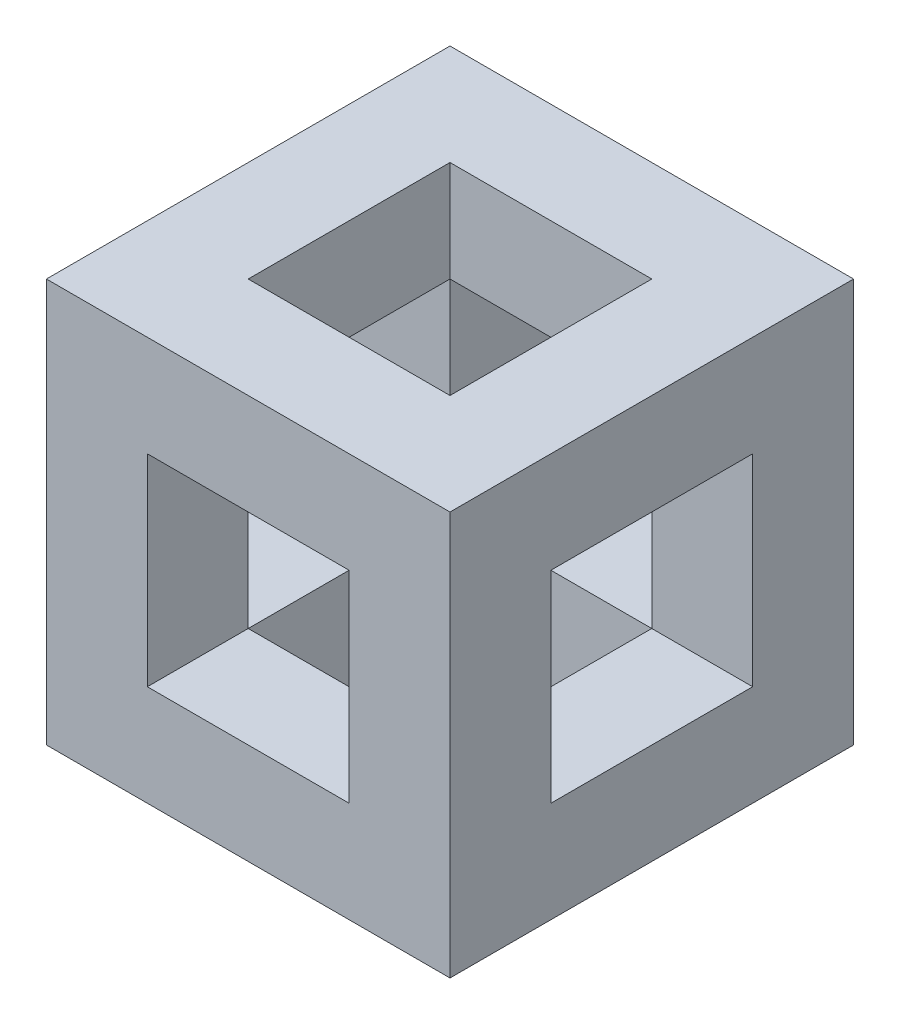
ISO-10303-21;
HEADER;
FILE_DESCRIPTION(('STEP AP214'),'2;1');
FILE_NAME('part.step','',(''),(''),'','','');
FILE_SCHEMA(('AUTOMOTIVE_DESIGN { 1 0 10303 214 1 1 1 1 }'));
ENDSEC;
DATA;
#1=APPLICATION_CONTEXT('core data for automotive mechanical design processes');
#2=APPLICATION_PROTOCOL_DEFINITION('international standard','automotive_design',2000,#1);
#3=PRODUCT_CONTEXT('',#1,'mechanical');
#4=PRODUCT('Part','Part','',(#3));
#5=PRODUCT_RELATED_PRODUCT_CATEGORY('part','',(#4));
#6=PRODUCT_DEFINITION_FORMATION('','',#4);
#7=PRODUCT_DEFINITION_CONTEXT('part definition',#1,'design');
#8=PRODUCT_DEFINITION('design','',#6,#7);
#9=PRODUCT_DEFINITION_SHAPE('','',#8);
#10=(LENGTH_UNIT() NAMED_UNIT(*) SI_UNIT(.MILLI.,.METRE.));
#11=(NAMED_UNIT(*) PLANE_ANGLE_UNIT() SI_UNIT($,.RADIAN.));
#12=(NAMED_UNIT(*) SI_UNIT($,.STERADIAN.) SOLID_ANGLE_UNIT());
#13=UNCERTAINTY_MEASURE_WITH_UNIT(LENGTH_MEASURE(1.E-05),#10,'distance_accuracy_value','');
#14=(GEOMETRIC_REPRESENTATION_CONTEXT(3) GLOBAL_UNCERTAINTY_ASSIGNED_CONTEXT((#13)) GLOBAL_UNIT_ASSIGNED_CONTEXT((#10,
#11,#12)) REPRESENTATION_CONTEXT('',''));
#15=CARTESIAN_POINT('',(0.,0.,0.));
#16=DIRECTION('',(0.,0.,1.));
#17=DIRECTION('',(1.,0.,0.));
#18=AXIS2_PLACEMENT_3D('',#15,#16,#17);
#19=CARTESIAN_POINT('',(12.5,-25.,37.5));
#20=DIRECTION('',(1.,0.,0.));
#21=DIRECTION('',(0.,1.,0.));
#22=AXIS2_PLACEMENT_3D('',#19,#20,#21);
#23=PLANE('',#22);
#24=DIRECTION('',(0.,1.,0.));
#25=VECTOR('',#24,1.);
#26=CARTESIAN_POINT('',(12.5,-25.,12.5));
#27=LINE('',#26,#25);
#28=CARTESIAN_POINT('',(12.5,12.5,12.5));
#29=VERTEX_POINT('',#28);
#30=CARTESIAN_POINT('',(12.5,25.,12.5));
#31=VERTEX_POINT('',#30);
#32=EDGE_CURVE('E364',#29,#31,#27,.T.);
#33=ORIENTED_EDGE('',*,*,#32,.F.);
#34=DIRECTION('',(0.,0.,1.));
#35=VECTOR('',#34,1.);
#36=CARTESIAN_POINT('',(12.5,12.5,37.5));
#37=LINE('',#36,#35);
#38=CARTESIAN_POINT('',(12.5,12.5,37.5));
#39=VERTEX_POINT('',#38);
#40=EDGE_CURVE('E256',#29,#39,#37,.T.);
#41=ORIENTED_EDGE('',*,*,#40,.T.);
#42=DIRECTION('',(0.,1.,0.));
#43=VECTOR('',#42,1.);
#44=CARTESIAN_POINT('',(12.5,-25.,37.5));
#45=LINE('',#44,#43);
#46=CARTESIAN_POINT('',(12.5,25.,37.5));
#47=VERTEX_POINT('',#46);
#48=EDGE_CURVE('E369',#39,#47,#45,.T.);
#49=ORIENTED_EDGE('',*,*,#48,.T.);
#50=DIRECTION('',(0.,0.,-1.));
#51=VECTOR('',#50,1.);
#52=CARTESIAN_POINT('',(12.5,25.,37.5));
#53=LINE('',#52,#51);
#54=EDGE_CURVE('E333',#47,#31,#53,.T.);
#55=ORIENTED_EDGE('',*,*,#54,.T.);
#56=EDGE_LOOP('',(#33,#41,#49,#55));
#57=FACE_BOUND('',#56,.T.);
#58=ADVANCED_FACE('F45',(#57),#23,.F.);
#59=DIRECTION('',(0.,0.,1.));
#60=VECTOR('',#59,1.);
#61=CARTESIAN_POINT('',(12.5,-12.5,37.5));
#62=LINE('',#61,#60);
#63=CARTESIAN_POINT('',(12.5,-12.5,12.5));
#64=VERTEX_POINT('',#63);
#65=CARTESIAN_POINT('',(12.5,-12.5,37.5));
#66=VERTEX_POINT('',#65);
#67=EDGE_CURVE('E252',#64,#66,#62,.T.);
#68=ORIENTED_EDGE('',*,*,#67,.F.);
#69=CARTESIAN_POINT('',(12.5,-25.,12.5));
#70=VERTEX_POINT('',#69);
#71=EDGE_CURVE('E359',#70,#64,#27,.T.);
#72=ORIENTED_EDGE('',*,*,#71,.F.);
#73=DIRECTION('',(0.,0.,-1.));
#74=VECTOR('',#73,1.);
#75=CARTESIAN_POINT('',(12.5,-25.,37.5));
#76=LINE('',#75,#74);
#77=CARTESIAN_POINT('',(12.5,-25.,37.5));
#78=VERTEX_POINT('',#77);
#79=EDGE_CURVE('E340',#78,#70,#76,.T.);
#80=ORIENTED_EDGE('',*,*,#79,.F.);
#81=EDGE_CURVE('E365',#78,#66,#45,.T.);
#82=ORIENTED_EDGE('',*,*,#81,.T.);
#83=EDGE_LOOP('',(#68,#72,#80,#82));
#84=FACE_BOUND('',#83,.T.);
#85=ADVANCED_FACE('F522',(#84),#23,.F.);
#86=DIRECTION('',(0.,1.,0.));
#87=VECTOR('',#86,1.);
#88=CARTESIAN_POINT('',(12.5,-25.,37.5));
#89=LINE('',#88,#87);
#90=EDGE_CURVE('E249',#66,#39,#89,.T.);
#91=ORIENTED_EDGE('',*,*,#90,.F.);
#92=DIRECTION('',(0.,0.,1.));
#93=VECTOR('',#92,1.);
#94=CARTESIAN_POINT('',(12.5,-12.5,0.));
#95=LINE('',#94,#93);
#96=CARTESIAN_POINT('',(12.5,-12.5,50.));
#97=VERTEX_POINT('',#96);
#98=EDGE_CURVE('E297',#66,#97,#95,.T.);
#99=ORIENTED_EDGE('',*,*,#98,.T.);
#100=DIRECTION('',(0.,1.,0.));
#101=VECTOR('',#100,1.);
#102=CARTESIAN_POINT('',(12.5,-12.5,50.));
#103=LINE('',#102,#101);
#104=CARTESIAN_POINT('',(12.5,12.5,50.));
#105=VERTEX_POINT('',#104);
#106=EDGE_CURVE('E260',#97,#105,#103,.T.);
#107=ORIENTED_EDGE('',*,*,#106,.T.);
#108=DIRECTION('',(0.,0.,1.));
#109=VECTOR('',#108,1.);
#110=CARTESIAN_POINT('',(12.5,12.5,0.));
#111=LINE('',#110,#109);
#112=EDGE_CURVE('E278',#39,#105,#111,.T.);
#113=ORIENTED_EDGE('',*,*,#112,.F.);
#114=EDGE_LOOP('',(#91,#99,#107,#113));
#115=FACE_BOUND('',#114,.T.);
#116=ADVANCED_FACE('F500',(#115),#23,.F.);
#117=CARTESIAN_POINT('',(-12.5,-25.,37.5));
#118=DIRECTION('',(1.,0.,0.));
#119=DIRECTION('',(0.,1.,0.));
#120=AXIS2_PLACEMENT_3D('',#117,#118,#119);
#121=PLANE('',#120);
#122=DIRECTION('',(0.,0.,1.));
#123=VECTOR('',#122,1.);
#124=CARTESIAN_POINT('',(-12.5,12.5,37.5));
#125=LINE('',#124,#123);
#126=CARTESIAN_POINT('',(-12.5,12.5,12.5));
#127=VERTEX_POINT('',#126);
#128=CARTESIAN_POINT('',(-12.5,12.5,37.5));
#129=VERTEX_POINT('',#128);
#130=EDGE_CURVE('E11',#127,#129,#125,.T.);
#131=ORIENTED_EDGE('',*,*,#130,.F.);
#132=DIRECTION('',(0.,1.,0.));
#133=VECTOR('',#132,1.);
#134=CARTESIAN_POINT('',(-12.5,-25.,12.5));
#135=LINE('',#134,#133);
#136=CARTESIAN_POINT('',(-12.5,25.,12.5));
#137=VERTEX_POINT('',#136);
#138=EDGE_CURVE('E344',#127,#137,#135,.T.);
#139=ORIENTED_EDGE('',*,*,#138,.T.);
#140=DIRECTION('',(0.,0.,-1.));
#141=VECTOR('',#140,1.);
#142=CARTESIAN_POINT('',(-12.5,25.,37.5));
#143=LINE('',#142,#141);
#144=CARTESIAN_POINT('',(-12.5,25.,37.5));
#145=VERTEX_POINT('',#144);
#146=EDGE_CURVE('E348',#145,#137,#143,.T.);
#147=ORIENTED_EDGE('',*,*,#146,.F.);
#148=DIRECTION('',(0.,1.,0.));
#149=VECTOR('',#148,1.);
#150=CARTESIAN_POINT('',(-12.5,-25.,37.5));
#151=LINE('',#150,#149);
#152=EDGE_CURVE('E374',#129,#145,#151,.T.);
#153=ORIENTED_EDGE('',*,*,#152,.F.);
#154=EDGE_LOOP('',(#131,#139,#147,#153));
#155=FACE_BOUND('',#154,.T.);
#156=ADVANCED_FACE('F515',(#155),#121,.T.);
#157=CARTESIAN_POINT('',(-12.5,-25.,12.5));
#158=VERTEX_POINT('',#157);
#159=CARTESIAN_POINT('',(-12.5,-12.5,12.5));
#160=VERTEX_POINT('',#159);
#161=EDGE_CURVE('E375',#158,#160,#135,.T.);
#162=ORIENTED_EDGE('',*,*,#161,.T.);
#163=DIRECTION('',(0.,0.,1.));
#164=VECTOR('',#163,1.);
#165=CARTESIAN_POINT('',(-12.5,-12.5,37.5));
#166=LINE('',#165,#164);
#167=CARTESIAN_POINT('',(-12.5,-12.5,37.5));
#168=VERTEX_POINT('',#167);
#169=EDGE_CURVE('E54',#160,#168,#166,.T.);
#170=ORIENTED_EDGE('',*,*,#169,.T.);
#171=CARTESIAN_POINT('',(-12.5,-25.,37.5));
#172=VERTEX_POINT('',#171);
#173=EDGE_CURVE('E370',#172,#168,#151,.T.);
#174=ORIENTED_EDGE('',*,*,#173,.F.);
#175=DIRECTION('',(0.,0.,-1.));
#176=VECTOR('',#175,1.);
#177=CARTESIAN_POINT('',(-12.5,-25.,37.5));
#178=LINE('',#177,#176);
#179=EDGE_CURVE('E332',#172,#158,#178,.T.);
#180=ORIENTED_EDGE('',*,*,#179,.T.);
#181=EDGE_LOOP('',(#162,#170,#174,#180));
#182=FACE_BOUND('',#181,.T.);
#183=ADVANCED_FACE('F422',(#182),#121,.T.);
#184=DIRECTION('',(0.,0.,1.));
#185=VECTOR('',#184,1.);
#186=CARTESIAN_POINT('',(-12.5,-12.5,0.));
#187=LINE('',#186,#185);
#188=CARTESIAN_POINT('',(-12.5,-12.5,50.));
#189=VERTEX_POINT('',#188);
#190=EDGE_CURVE('E302',#168,#189,#187,.T.);
#191=ORIENTED_EDGE('',*,*,#190,.F.);
#192=DIRECTION('',(0.,1.,0.));
#193=VECTOR('',#192,1.);
#194=CARTESIAN_POINT('',(-12.5,-25.,37.5));
#195=LINE('',#194,#193);
#196=EDGE_CURVE('E246',#168,#129,#195,.T.);
#197=ORIENTED_EDGE('',*,*,#196,.T.);
#198=DIRECTION('',(0.,0.,1.));
#199=VECTOR('',#198,1.);
#200=CARTESIAN_POINT('',(-12.5,12.5,0.));
#201=LINE('',#200,#199);
#202=CARTESIAN_POINT('',(-12.5,12.5,50.));
#203=VERTEX_POINT('',#202);
#204=EDGE_CURVE('E307',#129,#203,#201,.T.);
#205=ORIENTED_EDGE('',*,*,#204,.T.);
#206=DIRECTION('',(0.,-1.,0.));
#207=VECTOR('',#206,1.);
#208=CARTESIAN_POINT('',(-12.5,-12.5,50.));
#209=LINE('',#208,#207);
#210=EDGE_CURVE('E285',#203,#189,#209,.T.);
#211=ORIENTED_EDGE('',*,*,#210,.T.);
#212=EDGE_LOOP('',(#191,#197,#205,#211));
#213=FACE_BOUND('',#212,.T.);
#214=ADVANCED_FACE('F432',(#213),#121,.T.);
#215=CARTESIAN_POINT('',(12.5,-25.,12.5));
#216=DIRECTION('',(0.,0.,-1.));
#217=DIRECTION('',(-1.,0.,0.));
#218=AXIS2_PLACEMENT_3D('',#215,#216,#217);
#219=PLANE('',#218);
#220=ORIENTED_EDGE('',*,*,#71,.T.);
#221=DIRECTION('',(-1.,0.,0.));
#222=VECTOR('',#221,1.);
#223=CARTESIAN_POINT('',(12.5,-12.5,12.5));
#224=LINE('',#223,#222);
#225=EDGE_CURVE('E323',#64,#160,#224,.T.);
#226=ORIENTED_EDGE('',*,*,#225,.T.);
#227=ORIENTED_EDGE('',*,*,#161,.F.);
#228=DIRECTION('',(-1.,0.,0.));
#229=VECTOR('',#228,1.);
#230=CARTESIAN_POINT('',(12.5,-25.,12.5));
#231=LINE('',#230,#229);
#232=EDGE_CURVE('E328',#70,#158,#231,.T.);
#233=ORIENTED_EDGE('',*,*,#232,.F.);
#234=EDGE_LOOP('',(#220,#226,#227,#233));
#235=FACE_BOUND('',#234,.T.);
#236=ADVANCED_FACE('F446',(#235),#219,.F.);
#237=CARTESIAN_POINT('',(12.5,-25.,37.5));
#238=DIRECTION('',(0.,0.,-1.));
#239=DIRECTION('',(-1.,0.,0.));
#240=AXIS2_PLACEMENT_3D('',#237,#238,#239);
#241=PLANE('',#240);
#242=DIRECTION('',(-1.,0.,0.));
#243=VECTOR('',#242,1.);
#244=CARTESIAN_POINT('',(12.5,-12.5,37.5));
#245=LINE('',#244,#243);
#246=EDGE_CURVE('E319',#66,#168,#245,.T.);
#247=ORIENTED_EDGE('',*,*,#246,.F.);
#248=ORIENTED_EDGE('',*,*,#81,.F.);
#249=DIRECTION('',(-1.,0.,0.));
#250=VECTOR('',#249,1.);
#251=CARTESIAN_POINT('',(12.5,-25.,37.5));
#252=LINE('',#251,#250);
#253=EDGE_CURVE('E336',#78,#172,#252,.T.);
#254=ORIENTED_EDGE('',*,*,#253,.T.);
#255=ORIENTED_EDGE('',*,*,#173,.T.);
#256=EDGE_LOOP('',(#247,#248,#254,#255));
#257=FACE_BOUND('',#256,.T.);
#258=ADVANCED_FACE('F437',(#257),#241,.T.);
#259=CARTESIAN_POINT('',(-25.,-25.,50.));
#260=DIRECTION('',(1.,0.,0.));
#261=DIRECTION('',(0.,0.,-1.));
#262=AXIS2_PLACEMENT_3D('',#259,#260,#261);
#263=PLANE('',#262);
#264=DIRECTION('',(0.,1.,0.));
#265=VECTOR('',#264,1.);
#266=CARTESIAN_POINT('',(-25.,-12.5,12.5));
#267=LINE('',#266,#265);
#268=CARTESIAN_POINT('',(-25.,-12.5,12.5));
#269=VERTEX_POINT('',#268);
#270=CARTESIAN_POINT('',(-25.,12.5,12.5));
#271=VERTEX_POINT('',#270);
#272=EDGE_CURVE('E206',#269,#271,#267,.T.);
#273=ORIENTED_EDGE('',*,*,#272,.T.);
#274=DIRECTION('',(0.,0.,1.));
#275=VECTOR('',#274,1.);
#276=CARTESIAN_POINT('',(-25.,12.5,12.5));
#277=LINE('',#276,#275);
#278=CARTESIAN_POINT('',(-25.,12.5,37.5));
#279=VERTEX_POINT('',#278);
#280=EDGE_CURVE('E191',#271,#279,#277,.T.);
#281=ORIENTED_EDGE('',*,*,#280,.T.);
#282=DIRECTION('',(0.,1.,0.));
#283=VECTOR('',#282,1.);
#284=CARTESIAN_POINT('',(-25.,-12.5,37.5));
#285=LINE('',#284,#283);
#286=CARTESIAN_POINT('',(-25.,-12.5,37.5));
#287=VERTEX_POINT('',#286);
#288=EDGE_CURVE('E182',#287,#279,#285,.T.);
#289=ORIENTED_EDGE('',*,*,#288,.F.);
#290=DIRECTION('',(0.,0.,1.));
#291=VECTOR('',#290,1.);
#292=CARTESIAN_POINT('',(-25.,-12.5,12.5));
#293=LINE('',#292,#291);
#294=EDGE_CURVE('E190',#269,#287,#293,.T.);
#295=ORIENTED_EDGE('',*,*,#294,.F.);
#296=EDGE_LOOP('',(#273,#281,#289,#295));
#297=FACE_BOUND('',#296,.T.);
#298=DIRECTION('',(0.,-1.,0.));
#299=VECTOR('',#298,1.);
#300=CARTESIAN_POINT('',(-25.,-25.,0.));
#301=LINE('',#300,#299);
#302=CARTESIAN_POINT('',(-25.,25.,0.));
#303=VERTEX_POINT('',#302);
#304=CARTESIAN_POINT('',(-25.,-25.,0.));
#305=VERTEX_POINT('',#304);
#306=EDGE_CURVE('E363',#303,#305,#301,.T.);
#307=ORIENTED_EDGE('',*,*,#306,.T.);
#308=DIRECTION('',(0.,0.,-1.));
#309=VECTOR('',#308,1.);
#310=CARTESIAN_POINT('',(-25.,-25.,50.));
#311=LINE('',#310,#309);
#312=CARTESIAN_POINT('',(-25.,-25.,50.));
#313=VERTEX_POINT('',#312);
#314=EDGE_CURVE('E416',#313,#305,#311,.T.);
#315=ORIENTED_EDGE('',*,*,#314,.F.);
#316=DIRECTION('',(0.,-1.,0.));
#317=VECTOR('',#316,1.);
#318=CARTESIAN_POINT('',(-25.,-25.,50.));
#319=LINE('',#318,#317);
#320=CARTESIAN_POINT('',(-25.,25.,50.));
#321=VERTEX_POINT('',#320);
#322=EDGE_CURVE('E379',#321,#313,#319,.T.);
#323=ORIENTED_EDGE('',*,*,#322,.F.);
#324=DIRECTION('',(0.,0.,-1.));
#325=VECTOR('',#324,1.);
#326=CARTESIAN_POINT('',(-25.,25.,50.));
#327=LINE('',#326,#325);
#328=EDGE_CURVE('E393',#321,#303,#327,.T.);
#329=ORIENTED_EDGE('',*,*,#328,.T.);
#330=EDGE_LOOP('',(#307,#315,#323,#329));
#331=FACE_BOUND('',#330,.T.);
#332=ADVANCED_FACE('F47',(#297,#331),#263,.F.);
#333=CARTESIAN_POINT('',(25.,-25.,50.));
#334=DIRECTION('',(0.,1.,0.));
#335=DIRECTION('',(-1.,0.,0.));
#336=AXIS2_PLACEMENT_3D('',#333,#334,#335);
#337=PLANE('',#336);
#338=ORIENTED_EDGE('',*,*,#79,.T.);
#339=ORIENTED_EDGE('',*,*,#232,.T.);
#340=ORIENTED_EDGE('',*,*,#179,.F.);
#341=ORIENTED_EDGE('',*,*,#253,.F.);
#342=EDGE_LOOP('',(#338,#339,#340,#341));
#343=FACE_BOUND('',#342,.T.);
#344=DIRECTION('',(1.,0.,0.));
#345=VECTOR('',#344,1.);
#346=CARTESIAN_POINT('',(25.,-25.,0.));
#347=LINE('',#346,#345);
#348=CARTESIAN_POINT('',(25.,-25.,0.));
#349=VERTEX_POINT('',#348);
#350=EDGE_CURVE('E397',#305,#349,#347,.T.);
#351=ORIENTED_EDGE('',*,*,#350,.T.);
#352=DIRECTION('',(0.,0.,-1.));
#353=VECTOR('',#352,1.);
#354=CARTESIAN_POINT('',(25.,-25.,50.));
#355=LINE('',#354,#353);
#356=CARTESIAN_POINT('',(25.,-25.,50.));
#357=VERTEX_POINT('',#356);
#358=EDGE_CURVE('E412',#357,#349,#355,.T.);
#359=ORIENTED_EDGE('',*,*,#358,.F.);
#360=DIRECTION('',(1.,0.,0.));
#361=VECTOR('',#360,1.);
#362=CARTESIAN_POINT('',(25.,-25.,50.));
#363=LINE('',#362,#361);
#364=EDGE_CURVE('E383',#313,#357,#363,.T.);
#365=ORIENTED_EDGE('',*,*,#364,.F.);
#366=ORIENTED_EDGE('',*,*,#314,.T.);
#367=EDGE_LOOP('',(#351,#359,#365,#366));
#368=FACE_BOUND('',#367,.T.);
#369=ADVANCED_FACE('F442',(#343,#368),#337,.F.);
#370=CARTESIAN_POINT('',(25.,-25.,50.));
#371=DIRECTION('',(-1.,0.,0.));
#372=DIRECTION('',(0.,0.,1.));
#373=AXIS2_PLACEMENT_3D('',#370,#371,#372);
#374=PLANE('',#373);
#375=DIRECTION('',(0.,1.,0.));
#376=VECTOR('',#375,1.);
#377=CARTESIAN_POINT('',(25.,-12.5,37.5));
#378=LINE('',#377,#376);
#379=CARTESIAN_POINT('',(25.,-12.5,37.5));
#380=VERTEX_POINT('',#379);
#381=CARTESIAN_POINT('',(25.,12.5,37.5));
#382=VERTEX_POINT('',#381);
#383=EDGE_CURVE('E221',#380,#382,#378,.T.);
#384=ORIENTED_EDGE('',*,*,#383,.T.);
#385=DIRECTION('',(0.,0.,1.));
#386=VECTOR('',#385,1.);
#387=CARTESIAN_POINT('',(25.,12.5,12.5));
#388=LINE('',#387,#386);
#389=CARTESIAN_POINT('',(25.,12.5,12.5));
#390=VERTEX_POINT('',#389);
#391=EDGE_CURVE('E69',#390,#382,#388,.T.);
#392=ORIENTED_EDGE('',*,*,#391,.F.);
#393=DIRECTION('',(0.,1.,0.));
#394=VECTOR('',#393,1.);
#395=CARTESIAN_POINT('',(25.,-12.5,12.5));
#396=LINE('',#395,#394);
#397=CARTESIAN_POINT('',(25.,-12.5,12.5));
#398=VERTEX_POINT('',#397);
#399=EDGE_CURVE('E208',#398,#390,#396,.T.);
#400=ORIENTED_EDGE('',*,*,#399,.F.);
#401=DIRECTION('',(0.,0.,1.));
#402=VECTOR('',#401,1.);
#403=CARTESIAN_POINT('',(25.,-12.5,12.5));
#404=LINE('',#403,#402);
#405=EDGE_CURVE('E212',#398,#380,#404,.T.);
#406=ORIENTED_EDGE('',*,*,#405,.T.);
#407=EDGE_LOOP('',(#384,#392,#400,#406));
#408=FACE_BOUND('',#407,.T.);
#409=DIRECTION('',(0.,1.,0.));
#410=VECTOR('',#409,1.);
#411=CARTESIAN_POINT('',(25.,-25.,0.));
#412=LINE('',#411,#410);
#413=CARTESIAN_POINT('',(25.,25.,0.));
#414=VERTEX_POINT('',#413);
#415=EDGE_CURVE('E400',#349,#414,#412,.T.);
#416=ORIENTED_EDGE('',*,*,#415,.T.);
#417=DIRECTION('',(0.,0.,-1.));
#418=VECTOR('',#417,1.);
#419=CARTESIAN_POINT('',(25.,25.,50.));
#420=LINE('',#419,#418);
#421=CARTESIAN_POINT('',(25.,25.,50.));
#422=VERTEX_POINT('',#421);
#423=EDGE_CURVE('E408',#422,#414,#420,.T.);
#424=ORIENTED_EDGE('',*,*,#423,.F.);
#425=DIRECTION('',(0.,1.,0.));
#426=VECTOR('',#425,1.);
#427=CARTESIAN_POINT('',(25.,-25.,50.));
#428=LINE('',#427,#426);
#429=EDGE_CURVE('E387',#357,#422,#428,.T.);
#430=ORIENTED_EDGE('',*,*,#429,.F.);
#431=ORIENTED_EDGE('',*,*,#358,.T.);
#432=EDGE_LOOP('',(#416,#424,#430,#431));
#433=FACE_BOUND('',#432,.T.);
#434=ADVANCED_FACE('F489',(#408,#433),#374,.F.);
#435=CARTESIAN_POINT('',(25.,25.,50.));
#436=DIRECTION('',(0.,-1.,0.));
#437=DIRECTION('',(1.,0.,0.));
#438=AXIS2_PLACEMENT_3D('',#435,#436,#437);
#439=PLANE('',#438);
#440=ORIENTED_EDGE('',*,*,#146,.T.);
#441=DIRECTION('',(-1.,0.,0.));
#442=VECTOR('',#441,1.);
#443=CARTESIAN_POINT('',(12.5,25.,12.5));
#444=LINE('',#443,#442);
#445=EDGE_CURVE('E327',#31,#137,#444,.T.);
#446=ORIENTED_EDGE('',*,*,#445,.F.);
#447=ORIENTED_EDGE('',*,*,#54,.F.);
#448=DIRECTION('',(-1.,0.,0.));
#449=VECTOR('',#448,1.);
#450=CARTESIAN_POINT('',(12.5,25.,37.5));
#451=LINE('',#450,#449);
#452=EDGE_CURVE('E352',#47,#145,#451,.T.);
#453=ORIENTED_EDGE('',*,*,#452,.T.);
#454=EDGE_LOOP('',(#440,#446,#447,#453));
#455=FACE_BOUND('',#454,.T.);
#456=DIRECTION('',(-1.,0.,0.));
#457=VECTOR('',#456,1.);
#458=CARTESIAN_POINT('',(25.,25.,0.));
#459=LINE('',#458,#457);
#460=EDGE_CURVE('E384',#414,#303,#459,.T.);
#461=ORIENTED_EDGE('',*,*,#460,.T.);
#462=ORIENTED_EDGE('',*,*,#328,.F.);
#463=DIRECTION('',(-1.,0.,0.));
#464=VECTOR('',#463,1.);
#465=CARTESIAN_POINT('',(25.,25.,50.));
#466=LINE('',#465,#464);
#467=EDGE_CURVE('E390',#422,#321,#466,.T.);
#468=ORIENTED_EDGE('',*,*,#467,.F.);
#469=ORIENTED_EDGE('',*,*,#423,.T.);
#470=EDGE_LOOP('',(#461,#462,#468,#469));
#471=FACE_BOUND('',#470,.T.);
#472=ADVANCED_FACE('F512',(#455,#471),#439,.F.);
#473=CARTESIAN_POINT('',(0.,0.,50.));
#474=DIRECTION('',(0.,0.,1.));
#475=DIRECTION('',(1.,0.,0.));
#476=AXIS2_PLACEMENT_3D('',#473,#474,#475);
#477=PLANE('',#476);
#478=ORIENTED_EDGE('',*,*,#106,.F.);
#479=DIRECTION('',(1.,0.,0.));
#480=VECTOR('',#479,1.);
#481=CARTESIAN_POINT('',(-12.5,-12.5,50.));
#482=LINE('',#481,#480);
#483=EDGE_CURVE('E266',#189,#97,#482,.T.);
#484=ORIENTED_EDGE('',*,*,#483,.F.);
#485=ORIENTED_EDGE('',*,*,#210,.F.);
#486=DIRECTION('',(-1.,0.,0.));
#487=VECTOR('',#486,1.);
#488=CARTESIAN_POINT('',(-12.5,12.5,50.));
#489=LINE('',#488,#487);
#490=EDGE_CURVE('E281',#105,#203,#489,.T.);
#491=ORIENTED_EDGE('',*,*,#490,.F.);
#492=EDGE_LOOP('',(#478,#484,#485,#491));
#493=FACE_BOUND('',#492,.T.);
#494=ORIENTED_EDGE('',*,*,#322,.T.);
#495=ORIENTED_EDGE('',*,*,#364,.T.);
#496=ORIENTED_EDGE('',*,*,#429,.T.);
#497=ORIENTED_EDGE('',*,*,#467,.T.);
#498=EDGE_LOOP('',(#494,#495,#496,#497));
#499=FACE_BOUND('',#498,.T.);
#500=ADVANCED_FACE('F542',(#493,#499),#477,.T.);
#501=CARTESIAN_POINT('',(0.,0.,0.));
#502=DIRECTION('',(0.,0.,1.));
#503=DIRECTION('',(1.,0.,0.));
#504=AXIS2_PLACEMENT_3D('',#501,#502,#503);
#505=PLANE('',#504);
#506=DIRECTION('',(1.,0.,0.));
#507=VECTOR('',#506,1.);
#508=CARTESIAN_POINT('',(-12.5,-12.5,0.));
#509=LINE('',#508,#507);
#510=CARTESIAN_POINT('',(-12.5,-12.5,0.));
#511=VERTEX_POINT('',#510);
#512=CARTESIAN_POINT('',(12.5,-12.5,0.));
#513=VERTEX_POINT('',#512);
#514=EDGE_CURVE('E274',#511,#513,#509,.T.);
#515=ORIENTED_EDGE('',*,*,#514,.T.);
#516=DIRECTION('',(0.,1.,0.));
#517=VECTOR('',#516,1.);
#518=CARTESIAN_POINT('',(12.5,-12.5,0.));
#519=LINE('',#518,#517);
#520=CARTESIAN_POINT('',(12.5,12.5,0.));
#521=VERTEX_POINT('',#520);
#522=EDGE_CURVE('E261',#513,#521,#519,.T.);
#523=ORIENTED_EDGE('',*,*,#522,.T.);
#524=DIRECTION('',(-1.,0.,0.));
#525=VECTOR('',#524,1.);
#526=CARTESIAN_POINT('',(-12.5,12.5,0.));
#527=LINE('',#526,#525);
#528=CARTESIAN_POINT('',(-12.5,12.5,0.));
#529=VERTEX_POINT('',#528);
#530=EDGE_CURVE('E265',#521,#529,#527,.T.);
#531=ORIENTED_EDGE('',*,*,#530,.T.);
#532=DIRECTION('',(0.,-1.,0.));
#533=VECTOR('',#532,1.);
#534=CARTESIAN_POINT('',(-12.5,-12.5,0.));
#535=LINE('',#534,#533);
#536=EDGE_CURVE('E270',#529,#511,#535,.T.);
#537=ORIENTED_EDGE('',*,*,#536,.T.);
#538=EDGE_LOOP('',(#515,#523,#531,#537));
#539=FACE_BOUND('',#538,.T.);
#540=ORIENTED_EDGE('',*,*,#306,.F.);
#541=ORIENTED_EDGE('',*,*,#460,.F.);
#542=ORIENTED_EDGE('',*,*,#415,.F.);
#543=ORIENTED_EDGE('',*,*,#350,.F.);
#544=EDGE_LOOP('',(#540,#541,#542,#543));
#545=FACE_BOUND('',#544,.T.);
#546=ADVANCED_FACE('F456',(#539,#545),#505,.F.);
#547=ORIENTED_EDGE('',*,*,#138,.F.);
#548=DIRECTION('',(1.,0.,0.));
#549=VECTOR('',#548,1.);
#550=CARTESIAN_POINT('',(12.5,12.5,12.5));
#551=LINE('',#550,#549);
#552=EDGE_CURVE('E315',#127,#29,#551,.T.);
#553=ORIENTED_EDGE('',*,*,#552,.T.);
#554=ORIENTED_EDGE('',*,*,#32,.T.);
#555=ORIENTED_EDGE('',*,*,#445,.T.);
#556=EDGE_LOOP('',(#547,#553,#554,#555));
#557=FACE_BOUND('',#556,.T.);
#558=ADVANCED_FACE('F468',(#557),#219,.F.);
#559=EDGE_CURVE('E292',#513,#64,#95,.T.);
#560=ORIENTED_EDGE('',*,*,#559,.T.);
#561=DIRECTION('',(0.,1.,0.));
#562=VECTOR('',#561,1.);
#563=CARTESIAN_POINT('',(12.5,-25.,12.5));
#564=LINE('',#563,#562);
#565=EDGE_CURVE('E242',#64,#29,#564,.T.);
#566=ORIENTED_EDGE('',*,*,#565,.T.);
#567=EDGE_CURVE('E308',#521,#29,#111,.T.);
#568=ORIENTED_EDGE('',*,*,#567,.F.);
#569=ORIENTED_EDGE('',*,*,#522,.F.);
#570=EDGE_LOOP('',(#560,#566,#568,#569));
#571=FACE_BOUND('',#570,.T.);
#572=ADVANCED_FACE('F453',(#571),#23,.F.);
#573=DIRECTION('',(1.,0.,0.));
#574=VECTOR('',#573,1.);
#575=CARTESIAN_POINT('',(12.5,12.5,37.5));
#576=LINE('',#575,#574);
#577=EDGE_CURVE('E296',#129,#39,#576,.T.);
#578=ORIENTED_EDGE('',*,*,#577,.F.);
#579=ORIENTED_EDGE('',*,*,#152,.T.);
#580=ORIENTED_EDGE('',*,*,#452,.F.);
#581=ORIENTED_EDGE('',*,*,#48,.F.);
#582=EDGE_LOOP('',(#578,#579,#580,#581));
#583=FACE_BOUND('',#582,.T.);
#584=ADVANCED_FACE('F508',(#583),#241,.T.);
#585=DIRECTION('',(0.,1.,0.));
#586=VECTOR('',#585,1.);
#587=CARTESIAN_POINT('',(-12.5,-25.,12.5));
#588=LINE('',#587,#586);
#589=EDGE_CURVE('E231',#160,#127,#588,.T.);
#590=ORIENTED_EDGE('',*,*,#589,.F.);
#591=EDGE_CURVE('E298',#511,#160,#187,.T.);
#592=ORIENTED_EDGE('',*,*,#591,.F.);
#593=ORIENTED_EDGE('',*,*,#536,.F.);
#594=EDGE_CURVE('E303',#529,#127,#201,.T.);
#595=ORIENTED_EDGE('',*,*,#594,.T.);
#596=EDGE_LOOP('',(#590,#592,#593,#595));
#597=FACE_BOUND('',#596,.T.);
#598=ADVANCED_FACE('F461',(#597),#121,.T.);
#599=CARTESIAN_POINT('',(-12.5,12.5,0.));
#600=DIRECTION('',(0.,1.,0.));
#601=DIRECTION('',(0.,0.,1.));
#602=AXIS2_PLACEMENT_3D('',#599,#600,#601);
#603=PLANE('',#602);
#604=ORIENTED_EDGE('',*,*,#577,.T.);
#605=ORIENTED_EDGE('',*,*,#112,.T.);
#606=ORIENTED_EDGE('',*,*,#490,.T.);
#607=ORIENTED_EDGE('',*,*,#204,.F.);
#608=EDGE_LOOP('',(#604,#605,#606,#607));
#609=FACE_BOUND('',#608,.T.);
#610=ADVANCED_FACE('F527',(#609),#603,.F.);
#611=CARTESIAN_POINT('',(-12.5,-12.5,0.));
#612=DIRECTION('',(0.,-1.,0.));
#613=DIRECTION('',(0.,0.,-1.));
#614=AXIS2_PLACEMENT_3D('',#611,#612,#613);
#615=PLANE('',#614);
#616=ORIENTED_EDGE('',*,*,#246,.T.);
#617=ORIENTED_EDGE('',*,*,#190,.T.);
#618=ORIENTED_EDGE('',*,*,#483,.T.);
#619=ORIENTED_EDGE('',*,*,#98,.F.);
#620=EDGE_LOOP('',(#616,#617,#618,#619));
#621=FACE_BOUND('',#620,.T.);
#622=ADVANCED_FACE('F429',(#621),#615,.F.);
#623=ORIENTED_EDGE('',*,*,#559,.F.);
#624=ORIENTED_EDGE('',*,*,#514,.F.);
#625=ORIENTED_EDGE('',*,*,#591,.T.);
#626=ORIENTED_EDGE('',*,*,#225,.F.);
#627=EDGE_LOOP('',(#623,#624,#625,#626));
#628=FACE_BOUND('',#627,.T.);
#629=ADVANCED_FACE('F449',(#628),#615,.F.);
#630=ORIENTED_EDGE('',*,*,#594,.F.);
#631=ORIENTED_EDGE('',*,*,#530,.F.);
#632=ORIENTED_EDGE('',*,*,#567,.T.);
#633=ORIENTED_EDGE('',*,*,#552,.F.);
#634=EDGE_LOOP('',(#630,#631,#632,#633));
#635=FACE_BOUND('',#634,.T.);
#636=ADVANCED_FACE('F465',(#635),#603,.F.);
#637=CARTESIAN_POINT('',(-25.,-12.5,37.5));
#638=DIRECTION('',(0.,0.,-1.));
#639=DIRECTION('',(-1.,0.,0.));
#640=AXIS2_PLACEMENT_3D('',#637,#638,#639);
#641=PLANE('',#640);
#642=DIRECTION('',(1.,0.,0.));
#643=VECTOR('',#642,1.);
#644=CARTESIAN_POINT('',(-25.,-12.5,37.5));
#645=LINE('',#644,#643);
#646=EDGE_CURVE('E61',#287,#168,#645,.T.);
#647=ORIENTED_EDGE('',*,*,#646,.F.);
#648=ORIENTED_EDGE('',*,*,#288,.T.);
#649=DIRECTION('',(1.,0.,0.));
#650=VECTOR('',#649,1.);
#651=CARTESIAN_POINT('',(-25.,12.5,37.5));
#652=LINE('',#651,#650);
#653=EDGE_CURVE('E185',#279,#129,#652,.T.);
#654=ORIENTED_EDGE('',*,*,#653,.T.);
#655=ORIENTED_EDGE('',*,*,#196,.F.);
#656=EDGE_LOOP('',(#647,#648,#654,#655));
#657=FACE_BOUND('',#656,.T.);
#658=ADVANCED_FACE('F184',(#657),#641,.T.);
#659=CARTESIAN_POINT('',(-25.,-12.5,12.5));
#660=DIRECTION('',(0.,1.,0.));
#661=DIRECTION('',(0.,0.,1.));
#662=AXIS2_PLACEMENT_3D('',#659,#660,#661);
#663=PLANE('',#662);
#664=DIRECTION('',(1.,0.,0.));
#665=VECTOR('',#664,1.);
#666=CARTESIAN_POINT('',(-25.,-12.5,12.5));
#667=LINE('',#666,#665);
#668=EDGE_CURVE('E233',#269,#160,#667,.T.);
#669=ORIENTED_EDGE('',*,*,#668,.F.);
#670=ORIENTED_EDGE('',*,*,#294,.T.);
#671=ORIENTED_EDGE('',*,*,#646,.T.);
#672=ORIENTED_EDGE('',*,*,#169,.F.);
#673=EDGE_LOOP('',(#669,#670,#671,#672));
#674=FACE_BOUND('',#673,.T.);
#675=ADVANCED_FACE('F591',(#674),#663,.T.);
#676=CARTESIAN_POINT('',(-25.,-12.5,12.5));
#677=DIRECTION('',(0.,0.,-1.));
#678=DIRECTION('',(-1.,0.,0.));
#679=AXIS2_PLACEMENT_3D('',#676,#677,#678);
#680=PLANE('',#679);
#681=ORIENTED_EDGE('',*,*,#589,.T.);
#682=DIRECTION('',(1.,0.,0.));
#683=VECTOR('',#682,1.);
#684=CARTESIAN_POINT('',(-25.,12.5,12.5));
#685=LINE('',#684,#683);
#686=EDGE_CURVE('E228',#271,#127,#685,.T.);
#687=ORIENTED_EDGE('',*,*,#686,.F.);
#688=ORIENTED_EDGE('',*,*,#272,.F.);
#689=ORIENTED_EDGE('',*,*,#668,.T.);
#690=EDGE_LOOP('',(#681,#687,#688,#689));
#691=FACE_BOUND('',#690,.T.);
#692=ADVANCED_FACE('F599',(#691),#680,.F.);
#693=CARTESIAN_POINT('',(-25.,12.5,12.5));
#694=DIRECTION('',(0.,1.,0.));
#695=DIRECTION('',(0.,0.,1.));
#696=AXIS2_PLACEMENT_3D('',#693,#694,#695);
#697=PLANE('',#696);
#698=ORIENTED_EDGE('',*,*,#130,.T.);
#699=ORIENTED_EDGE('',*,*,#653,.F.);
#700=ORIENTED_EDGE('',*,*,#280,.F.);
#701=ORIENTED_EDGE('',*,*,#686,.T.);
#702=EDGE_LOOP('',(#698,#699,#700,#701));
#703=FACE_BOUND('',#702,.T.);
#704=ADVANCED_FACE('F195',(#703),#697,.F.);
#705=EDGE_CURVE('E232',#29,#390,#685,.T.);
#706=ORIENTED_EDGE('',*,*,#705,.T.);
#707=ORIENTED_EDGE('',*,*,#391,.T.);
#708=EDGE_CURVE('E202',#39,#382,#652,.T.);
#709=ORIENTED_EDGE('',*,*,#708,.F.);
#710=ORIENTED_EDGE('',*,*,#40,.F.);
#711=EDGE_LOOP('',(#706,#707,#709,#710));
#712=FACE_BOUND('',#711,.T.);
#713=ADVANCED_FACE('F616',(#712),#697,.F.);
#714=ORIENTED_EDGE('',*,*,#67,.T.);
#715=EDGE_CURVE('E201',#66,#380,#645,.T.);
#716=ORIENTED_EDGE('',*,*,#715,.T.);
#717=ORIENTED_EDGE('',*,*,#405,.F.);
#718=EDGE_CURVE('E237',#64,#398,#667,.T.);
#719=ORIENTED_EDGE('',*,*,#718,.F.);
#720=EDGE_LOOP('',(#714,#716,#717,#719));
#721=FACE_BOUND('',#720,.T.);
#722=ADVANCED_FACE('F495',(#721),#663,.T.);
#723=ORIENTED_EDGE('',*,*,#90,.T.);
#724=ORIENTED_EDGE('',*,*,#708,.T.);
#725=ORIENTED_EDGE('',*,*,#383,.F.);
#726=ORIENTED_EDGE('',*,*,#715,.F.);
#727=EDGE_LOOP('',(#723,#724,#725,#726));
#728=FACE_BOUND('',#727,.T.);
#729=ADVANCED_FACE('F486',(#728),#641,.T.);
#730=ORIENTED_EDGE('',*,*,#718,.T.);
#731=ORIENTED_EDGE('',*,*,#399,.T.);
#732=ORIENTED_EDGE('',*,*,#705,.F.);
#733=ORIENTED_EDGE('',*,*,#565,.F.);
#734=EDGE_LOOP('',(#730,#731,#732,#733));
#735=FACE_BOUND('',#734,.T.);
#736=ADVANCED_FACE('F609',(#735),#680,.F.);
#737=CLOSED_SHELL('',(#58,#85,#116,#156,#183,#214,#236,#258,#332,#369,#434,#472,#500,#546,#558,
#572,#584,#598,#610,#622,#629,#636,#658,#675,#692,#704,#713,#722,#729,#736));
#738=MANIFOLD_SOLID_BREP('B2',#737);
#739=ADVANCED_BREP_SHAPE_REPRESENTATION('',(#18,#738),#14);
#740=SHAPE_DEFINITION_REPRESENTATION(#9,#739);
ENDSEC;
END-ISO-10303-21;
